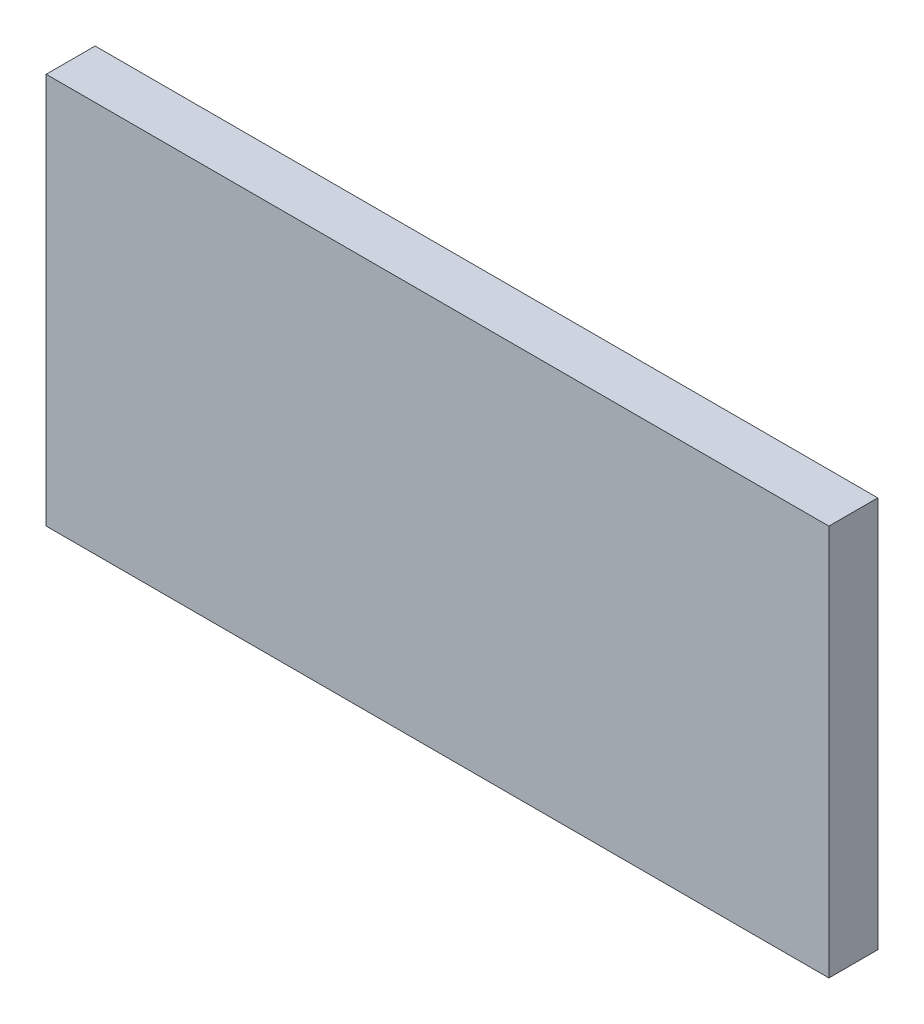
ISO-10303-21;
HEADER;
FILE_DESCRIPTION(('STEP AP214'),'2;1');
FILE_NAME('part.step','',(''),(''),'','','');
FILE_SCHEMA(('AUTOMOTIVE_DESIGN { 1 0 10303 214 1 1 1 1 }'));
ENDSEC;
DATA;
#1=APPLICATION_CONTEXT('core data for automotive mechanical design processes');
#2=APPLICATION_PROTOCOL_DEFINITION('international standard','automotive_design',2000,#1);
#3=PRODUCT_CONTEXT('',#1,'mechanical');
#4=PRODUCT('Part','Part','',(#3));
#5=PRODUCT_RELATED_PRODUCT_CATEGORY('part','',(#4));
#6=PRODUCT_DEFINITION_FORMATION('','',#4);
#7=PRODUCT_DEFINITION_CONTEXT('part definition',#1,'design');
#8=PRODUCT_DEFINITION('design','',#6,#7);
#9=PRODUCT_DEFINITION_SHAPE('','',#8);
#10=(LENGTH_UNIT() NAMED_UNIT(*) SI_UNIT(.MILLI.,.METRE.));
#11=(NAMED_UNIT(*) PLANE_ANGLE_UNIT() SI_UNIT($,.RADIAN.));
#12=(NAMED_UNIT(*) SI_UNIT($,.STERADIAN.) SOLID_ANGLE_UNIT());
#13=UNCERTAINTY_MEASURE_WITH_UNIT(LENGTH_MEASURE(1.E-05),#10,'distance_accuracy_value','');
#14=(GEOMETRIC_REPRESENTATION_CONTEXT(3) GLOBAL_UNCERTAINTY_ASSIGNED_CONTEXT((#13)) GLOBAL_UNIT_ASSIGNED_CONTEXT((#10,
#11,#12)) REPRESENTATION_CONTEXT('',''));
#15=CARTESIAN_POINT('',(0.,0.,0.));
#16=DIRECTION('',(0.,0.,1.));
#17=DIRECTION('',(1.,0.,0.));
#18=AXIS2_PLACEMENT_3D('',#15,#16,#17);
#19=CARTESIAN_POINT('',(12.7,87.15,1.5875));
#20=DIRECTION('',(-1.,0.,0.));
#21=DIRECTION('',(0.,0.,1.));
#22=AXIS2_PLACEMENT_3D('',#19,#20,#21);
#23=PLANE('',#22);
#24=DIRECTION('',(0.,1.,0.));
#25=VECTOR('',#24,1.);
#26=CARTESIAN_POINT('',(12.7,87.15,0.));
#27=LINE('',#26,#25);
#28=CARTESIAN_POINT('',(12.7,87.15,0.));
#29=VERTEX_POINT('',#28);
#30=CARTESIAN_POINT('',(12.7,99.85,0.));
#31=VERTEX_POINT('',#30);
#32=EDGE_CURVE('E104',#29,#31,#27,.T.);
#33=ORIENTED_EDGE('',*,*,#32,.T.);
#34=DIRECTION('',(0.,0.,-1.));
#35=VECTOR('',#34,1.);
#36=CARTESIAN_POINT('',(12.7,99.85,1.5875));
#37=LINE('',#36,#35);
#38=CARTESIAN_POINT('',(12.7,99.85,1.5875));
#39=VERTEX_POINT('',#38);
#40=EDGE_CURVE('E11',#39,#31,#37,.T.);
#41=ORIENTED_EDGE('',*,*,#40,.F.);
#42=DIRECTION('',(0.,1.,0.));
#43=VECTOR('',#42,1.);
#44=CARTESIAN_POINT('',(12.7,87.15,1.5875));
#45=LINE('',#44,#43);
#46=CARTESIAN_POINT('',(12.7,87.15,1.5875));
#47=VERTEX_POINT('',#46);
#48=EDGE_CURVE('E92',#47,#39,#45,.T.);
#49=ORIENTED_EDGE('',*,*,#48,.F.);
#50=DIRECTION('',(0.,0.,-1.));
#51=VECTOR('',#50,1.);
#52=CARTESIAN_POINT('',(12.7,87.15,1.5875));
#53=LINE('',#52,#51);
#54=EDGE_CURVE('E100',#47,#29,#53,.T.);
#55=ORIENTED_EDGE('',*,*,#54,.T.);
#56=EDGE_LOOP('',(#33,#41,#49,#55));
#57=FACE_BOUND('',#56,.T.);
#58=ADVANCED_FACE('F41',(#57),#23,.F.);
#59=CARTESIAN_POINT('',(-12.7,99.85,1.5875));
#60=DIRECTION('',(0.,-1.,0.));
#61=DIRECTION('',(0.,0.,-1.));
#62=AXIS2_PLACEMENT_3D('',#59,#60,#61);
#63=PLANE('',#62);
#64=DIRECTION('',(-1.,0.,0.));
#65=VECTOR('',#64,1.);
#66=CARTESIAN_POINT('',(-12.7,99.85,0.));
#67=LINE('',#66,#65);
#68=CARTESIAN_POINT('',(-12.7,99.85,0.));
#69=VERTEX_POINT('',#68);
#70=EDGE_CURVE('E96',#31,#69,#67,.T.);
#71=ORIENTED_EDGE('',*,*,#70,.T.);
#72=DIRECTION('',(0.,0.,-1.));
#73=VECTOR('',#72,1.);
#74=CARTESIAN_POINT('',(-12.7,99.85,1.5875));
#75=LINE('',#74,#73);
#76=CARTESIAN_POINT('',(-12.7,99.85,1.5875));
#77=VERTEX_POINT('',#76);
#78=EDGE_CURVE('E49',#77,#69,#75,.T.);
#79=ORIENTED_EDGE('',*,*,#78,.F.);
#80=DIRECTION('',(-1.,0.,0.));
#81=VECTOR('',#80,1.);
#82=CARTESIAN_POINT('',(-12.7,99.85,1.5875));
#83=LINE('',#82,#81);
#84=EDGE_CURVE('E87',#39,#77,#83,.T.);
#85=ORIENTED_EDGE('',*,*,#84,.F.);
#86=ORIENTED_EDGE('',*,*,#40,.T.);
#87=EDGE_LOOP('',(#71,#79,#85,#86));
#88=FACE_BOUND('',#87,.T.);
#89=ADVANCED_FACE('F95',(#88),#63,.F.);
#90=CARTESIAN_POINT('',(-12.7,87.15,1.5875));
#91=DIRECTION('',(1.,0.,0.));
#92=DIRECTION('',(0.,0.,-1.));
#93=AXIS2_PLACEMENT_3D('',#90,#91,#92);
#94=PLANE('',#93);
#95=DIRECTION('',(0.,-1.,0.));
#96=VECTOR('',#95,1.);
#97=CARTESIAN_POINT('',(-12.7,87.15,0.));
#98=LINE('',#97,#96);
#99=CARTESIAN_POINT('',(-12.7,87.15,0.));
#100=VERTEX_POINT('',#99);
#101=EDGE_CURVE('E74',#69,#100,#98,.T.);
#102=ORIENTED_EDGE('',*,*,#101,.T.);
#103=DIRECTION('',(0.,0.,-1.));
#104=VECTOR('',#103,1.);
#105=CARTESIAN_POINT('',(-12.7,87.15,1.5875));
#106=LINE('',#105,#104);
#107=CARTESIAN_POINT('',(-12.7,87.15,1.5875));
#108=VERTEX_POINT('',#107);
#109=EDGE_CURVE('E97',#108,#100,#106,.T.);
#110=ORIENTED_EDGE('',*,*,#109,.F.);
#111=DIRECTION('',(0.,-1.,0.));
#112=VECTOR('',#111,1.);
#113=CARTESIAN_POINT('',(-12.7,87.15,1.5875));
#114=LINE('',#113,#112);
#115=EDGE_CURVE('E90',#77,#108,#114,.T.);
#116=ORIENTED_EDGE('',*,*,#115,.F.);
#117=ORIENTED_EDGE('',*,*,#78,.T.);
#118=EDGE_LOOP('',(#102,#110,#116,#117));
#119=FACE_BOUND('',#118,.T.);
#120=ADVANCED_FACE('F98',(#119),#94,.F.);
#121=CARTESIAN_POINT('',(-12.7,87.15,1.5875));
#122=DIRECTION('',(0.,1.,0.));
#123=DIRECTION('',(0.,0.,1.));
#124=AXIS2_PLACEMENT_3D('',#121,#122,#123);
#125=PLANE('',#124);
#126=DIRECTION('',(1.,0.,0.));
#127=VECTOR('',#126,1.);
#128=CARTESIAN_POINT('',(-12.7,87.15,0.));
#129=LINE('',#128,#127);
#130=EDGE_CURVE('E80',#100,#29,#129,.T.);
#131=ORIENTED_EDGE('',*,*,#130,.T.);
#132=ORIENTED_EDGE('',*,*,#54,.F.);
#133=DIRECTION('',(1.,0.,0.));
#134=VECTOR('',#133,1.);
#135=CARTESIAN_POINT('',(-12.7,87.15,1.5875));
#136=LINE('',#135,#134);
#137=EDGE_CURVE('E57',#108,#47,#136,.T.);
#138=ORIENTED_EDGE('',*,*,#137,.F.);
#139=ORIENTED_EDGE('',*,*,#109,.T.);
#140=EDGE_LOOP('',(#131,#132,#138,#139));
#141=FACE_BOUND('',#140,.T.);
#142=ADVANCED_FACE('F111',(#141),#125,.F.);
#143=CARTESIAN_POINT('',(0.,0.,1.5875));
#144=DIRECTION('',(0.,0.,-1.));
#145=DIRECTION('',(-1.,0.,0.));
#146=AXIS2_PLACEMENT_3D('',#143,#144,#145);
#147=PLANE('',#146);
#148=ORIENTED_EDGE('',*,*,#48,.T.);
#149=ORIENTED_EDGE('',*,*,#84,.T.);
#150=ORIENTED_EDGE('',*,*,#115,.T.);
#151=ORIENTED_EDGE('',*,*,#137,.T.);
#152=EDGE_LOOP('',(#148,#149,#150,#151));
#153=FACE_BOUND('',#152,.T.);
#154=ADVANCED_FACE('F88',(#153),#147,.F.);
#155=CARTESIAN_POINT('',(0.,0.,0.));
#156=DIRECTION('',(0.,0.,-1.));
#157=DIRECTION('',(-1.,0.,0.));
#158=AXIS2_PLACEMENT_3D('',#155,#156,#157);
#159=PLANE('',#158);
#160=ORIENTED_EDGE('',*,*,#32,.F.);
#161=ORIENTED_EDGE('',*,*,#130,.F.);
#162=ORIENTED_EDGE('',*,*,#101,.F.);
#163=ORIENTED_EDGE('',*,*,#70,.F.);
#164=EDGE_LOOP('',(#160,#161,#162,#163));
#165=FACE_BOUND('',#164,.T.);
#166=ADVANCED_FACE('F114',(#165),#159,.T.);
#167=CLOSED_SHELL('',(#58,#89,#120,#142,#154,#166));
#168=MANIFOLD_SOLID_BREP('B2',#167);
#169=ADVANCED_BREP_SHAPE_REPRESENTATION('',(#18,#168),#14);
#170=SHAPE_DEFINITION_REPRESENTATION(#9,#169);
ENDSEC;
END-ISO-10303-21;
